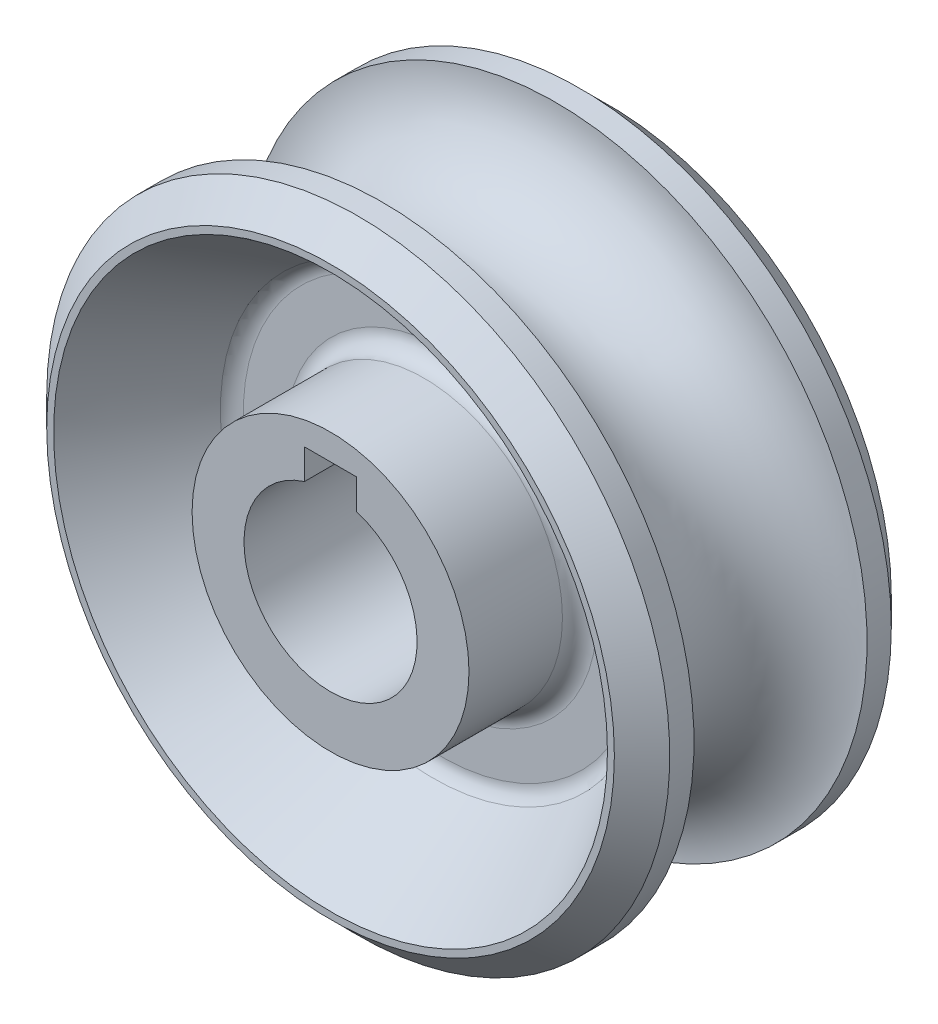
ISO-10303-21;
HEADER;
FILE_DESCRIPTION(('STEP AP214'),'2;1');
FILE_NAME('part.step','',(''),(''),'','','');
FILE_SCHEMA(('AUTOMOTIVE_DESIGN { 1 0 10303 214 1 1 1 1 }'));
ENDSEC;
DATA;
#1=APPLICATION_CONTEXT('core data for automotive mechanical design processes');
#2=APPLICATION_PROTOCOL_DEFINITION('international standard','automotive_design',2000,#1);
#3=PRODUCT_CONTEXT('',#1,'mechanical');
#4=PRODUCT('Part','Part','',(#3));
#5=PRODUCT_RELATED_PRODUCT_CATEGORY('part','',(#4));
#6=PRODUCT_DEFINITION_FORMATION('','',#4);
#7=PRODUCT_DEFINITION_CONTEXT('part definition',#1,'design');
#8=PRODUCT_DEFINITION('design','',#6,#7);
#9=PRODUCT_DEFINITION_SHAPE('','',#8);
#10=(LENGTH_UNIT() NAMED_UNIT(*) SI_UNIT(.MILLI.,.METRE.));
#11=(NAMED_UNIT(*) PLANE_ANGLE_UNIT() SI_UNIT($,.RADIAN.));
#12=(NAMED_UNIT(*) SI_UNIT($,.STERADIAN.) SOLID_ANGLE_UNIT());
#13=UNCERTAINTY_MEASURE_WITH_UNIT(LENGTH_MEASURE(1.E-05),#10,'distance_accuracy_value','');
#14=(GEOMETRIC_REPRESENTATION_CONTEXT(3) GLOBAL_UNCERTAINTY_ASSIGNED_CONTEXT((#13)) GLOBAL_UNIT_ASSIGNED_CONTEXT((#10,
#11,#12)) REPRESENTATION_CONTEXT('',''));
#15=CARTESIAN_POINT('',(0.,0.,0.));
#16=DIRECTION('',(0.,0.,1.));
#17=DIRECTION('',(1.,0.,0.));
#18=AXIS2_PLACEMENT_3D('',#15,#16,#17);
#19=CARTESIAN_POINT('',(0.,0.,12.7));
#20=DIRECTION('',(0.,0.,1.));
#21=DIRECTION('',(1.,0.,0.));
#22=AXIS2_PLACEMENT_3D('',#19,#20,#21);
#23=PLANE('',#22);
#24=DIRECTION('',(0.,-1.,0.));
#25=VECTOR('',#24,1.);
#26=CARTESIAN_POINT('',(-2.3876,10.3251,12.7));
#27=LINE('',#26,#25);
#28=CARTESIAN_POINT('',(-2.3876,10.3251,12.7));
#29=VERTEX_POINT('',#28);
#30=CARTESIAN_POINT('',(-2.3876,7.56989250187874,12.7));
#31=VERTEX_POINT('',#30);
#32=EDGE_CURVE('E82',#29,#31,#27,.T.);
#33=ORIENTED_EDGE('',*,*,#32,.F.);
#34=DIRECTION('',(-1.,0.,0.));
#35=VECTOR('',#34,1.);
#36=CARTESIAN_POINT('',(-2.3876,10.3251,12.7));
#37=LINE('',#36,#35);
#38=CARTESIAN_POINT('',(2.3876,10.3251,12.7));
#39=VERTEX_POINT('',#38);
#40=EDGE_CURVE('E81',#39,#29,#37,.T.);
#41=ORIENTED_EDGE('',*,*,#40,.F.);
#42=DIRECTION('',(0.,1.,0.));
#43=VECTOR('',#42,1.);
#44=CARTESIAN_POINT('',(2.3876,10.3251,12.7));
#45=LINE('',#44,#43);
#46=CARTESIAN_POINT('',(2.3876,7.56989250187874,12.7));
#47=VERTEX_POINT('',#46);
#48=EDGE_CURVE('E72',#47,#39,#45,.T.);
#49=ORIENTED_EDGE('',*,*,#48,.F.);
#50=CARTESIAN_POINT('',(0.,0.,12.7));
#51=DIRECTION('',(0.,0.,1.));
#52=DIRECTION('',(1.,0.,0.));
#53=AXIS2_PLACEMENT_3D('',#50,#51,#52);
#54=CIRCLE('',#53,7.9375);
#55=EDGE_CURVE('E114',#31,#47,#54,.T.);
#56=ORIENTED_EDGE('',*,*,#55,.F.);
#57=EDGE_LOOP('',(#33,#41,#49,#56));
#58=FACE_BOUND('',#57,.T.);
#59=CARTESIAN_POINT('',(0.,0.,12.7));
#60=DIRECTION('',(0.,0.,1.));
#61=DIRECTION('',(1.,0.,0.));
#62=AXIS2_PLACEMENT_3D('',#59,#60,#61);
#63=CIRCLE('',#62,12.7);
#64=CARTESIAN_POINT('',(12.7,0.,12.7));
#65=VERTEX_POINT('',#64);
#66=EDGE_CURVE('E100',#65,#65,#63,.T.);
#67=ORIENTED_EDGE('',*,*,#66,.T.);
#68=EDGE_LOOP('',(#67));
#69=FACE_BOUND('',#68,.T.);
#70=ADVANCED_FACE('F34',(#58,#69),#23,.T.);
#71=CARTESIAN_POINT('',(0.,0.,-12.7));
#72=DIRECTION('',(0.,0.,1.));
#73=DIRECTION('',(1.,0.,0.));
#74=AXIS2_PLACEMENT_3D('',#71,#72,#73);
#75=PLANE('',#74);
#76=CARTESIAN_POINT('',(0.,0.,-12.7));
#77=DIRECTION('',(0.,0.,1.));
#78=DIRECTION('',(1.,0.,0.));
#79=AXIS2_PLACEMENT_3D('',#76,#77,#78);
#80=CIRCLE('',#79,26.035);
#81=CARTESIAN_POINT('',(26.035,0.,-12.7));
#82=VERTEX_POINT('',#81);
#83=EDGE_CURVE('E133',#82,#82,#80,.F.);
#84=ORIENTED_EDGE('',*,*,#83,.T.);
#85=EDGE_LOOP('',(#84));
#86=FACE_BOUND('',#85,.T.);
#87=CARTESIAN_POINT('',(0.,0.,-12.7));
#88=DIRECTION('',(0.,0.,1.));
#89=DIRECTION('',(1.,0.,0.));
#90=AXIS2_PLACEMENT_3D('',#87,#88,#89);
#91=CIRCLE('',#90,25.4);
#92=CARTESIAN_POINT('',(25.4,0.,-12.7));
#93=VERTEX_POINT('',#92);
#94=EDGE_CURVE('E110',#93,#93,#91,.T.);
#95=ORIENTED_EDGE('',*,*,#94,.T.);
#96=EDGE_LOOP('',(#95));
#97=FACE_BOUND('',#96,.T.);
#98=ADVANCED_FACE('F185',(#86,#97),#75,.F.);
#99=DIRECTION('',(-1.,0.,0.));
#100=VECTOR('',#99,1.);
#101=CARTESIAN_POINT('',(-2.3876,10.3251,-12.7));
#102=LINE('',#101,#100);
#103=CARTESIAN_POINT('',(2.3876,10.3251,-12.7));
#104=VERTEX_POINT('',#103);
#105=CARTESIAN_POINT('',(-2.3876,10.3251,-12.7));
#106=VERTEX_POINT('',#105);
#107=EDGE_CURVE('E89',#104,#106,#102,.T.);
#108=ORIENTED_EDGE('',*,*,#107,.T.);
#109=DIRECTION('',(0.,-1.,0.));
#110=VECTOR('',#109,1.);
#111=CARTESIAN_POINT('',(-2.3876,10.3251,-12.7));
#112=LINE('',#111,#110);
#113=CARTESIAN_POINT('',(-2.3876,7.56989250187874,-12.7));
#114=VERTEX_POINT('',#113);
#115=EDGE_CURVE('E93',#106,#114,#112,.T.);
#116=ORIENTED_EDGE('',*,*,#115,.T.);
#117=CARTESIAN_POINT('',(0.,0.,-12.7));
#118=DIRECTION('',(0.,0.,1.));
#119=DIRECTION('',(1.,0.,0.));
#120=AXIS2_PLACEMENT_3D('',#117,#118,#119);
#121=CIRCLE('',#120,7.9375);
#122=CARTESIAN_POINT('',(2.3876,7.56989250187874,-12.7));
#123=VERTEX_POINT('',#122);
#124=EDGE_CURVE('E117',#114,#123,#121,.T.);
#125=ORIENTED_EDGE('',*,*,#124,.T.);
#126=DIRECTION('',(0.,1.,0.));
#127=VECTOR('',#126,1.);
#128=CARTESIAN_POINT('',(2.3876,10.3251,-12.7));
#129=LINE('',#128,#127);
#130=EDGE_CURVE('E49',#123,#104,#129,.T.);
#131=ORIENTED_EDGE('',*,*,#130,.T.);
#132=EDGE_LOOP('',(#108,#116,#125,#131));
#133=FACE_BOUND('',#132,.T.);
#134=CARTESIAN_POINT('',(0.,0.,-12.7));
#135=DIRECTION('',(0.,0.,1.));
#136=DIRECTION('',(1.,0.,0.));
#137=AXIS2_PLACEMENT_3D('',#134,#135,#136);
#138=CIRCLE('',#137,12.7);
#139=CARTESIAN_POINT('',(12.7,0.,-12.7));
#140=VERTEX_POINT('',#139);
#141=EDGE_CURVE('E107',#140,#140,#138,.T.);
#142=ORIENTED_EDGE('',*,*,#141,.F.);
#143=EDGE_LOOP('',(#142));
#144=FACE_BOUND('',#143,.T.);
#145=ADVANCED_FACE('F191',(#133,#144),#75,.F.);
#146=CARTESIAN_POINT('',(0.,0.,12.7));
#147=DIRECTION('',(0.,0.,-1.));
#148=DIRECTION('',(-1.,0.,0.));
#149=AXIS2_PLACEMENT_3D('',#146,#147,#148);
#150=CYLINDRICAL_SURFACE('',#149,28.575);
#151=CARTESIAN_POINT('',(0.,0.,10.16));
#152=DIRECTION('',(0.,0.,1.));
#153=DIRECTION('',(1.,0.,0.));
#154=AXIS2_PLACEMENT_3D('',#151,#152,#153);
#155=CIRCLE('',#154,28.575);
#156=CARTESIAN_POINT('',(-28.575,0.,10.16));
#157=VERTEX_POINT('',#156);
#158=EDGE_CURVE('E127',#157,#157,#155,.F.);
#159=CARTESIAN_POINT('',(0.,0.,7.9375));
#160=DIRECTION('',(0.,0.,-1.));
#161=DIRECTION('',(-1.,0.,0.));
#162=AXIS2_PLACEMENT_3D('',#159,#160,#161);
#163=CIRCLE('',#162,28.575);
#164=CARTESIAN_POINT('',(-28.575,0.,7.9375));
#165=VERTEX_POINT('',#164);
#166=EDGE_CURVE('E120',#165,#165,#163,.T.);
#167=CARTESIAN_POINT('',(-28.575,0.,10.16));
#168=CARTESIAN_POINT('',(-28.575,0.,10.1368489583334));
#169=CARTESIAN_POINT('',(-28.575,0.,10.1136979166667));
#170=CARTESIAN_POINT('',(-28.575,0.,10.0673958333334));
#171=CARTESIAN_POINT('',(-28.575,0.,10.0442447916667));
#172=CARTESIAN_POINT('',(-28.575,0.,9.99794270833336));
#173=CARTESIAN_POINT('',(-28.575,0.,9.97479166666669));
#174=CARTESIAN_POINT('',(-28.575,0.,9.92848958333336));
#175=CARTESIAN_POINT('',(-28.575,0.,9.90533854166669));
#176=CARTESIAN_POINT('',(-28.575,0.,9.85903645833336));
#177=CARTESIAN_POINT('',(-28.575,0.,9.83588541666669));
#178=CARTESIAN_POINT('',(-28.575,0.,9.78958333333336));
#179=CARTESIAN_POINT('',(-28.575,0.,9.76643229166669));
#180=CARTESIAN_POINT('',(-28.575,0.,9.72013020833336));
#181=CARTESIAN_POINT('',(-28.575,0.,9.69697916666669));
#182=CARTESIAN_POINT('',(-28.575,0.,9.65067708333335));
#183=CARTESIAN_POINT('',(-28.575,0.,9.62752604166669));
#184=CARTESIAN_POINT('',(-28.575,0.,9.58122395833335));
#185=CARTESIAN_POINT('',(-28.575,0.,9.55807291666669));
#186=CARTESIAN_POINT('',(-28.575,0.,9.51177083333335));
#187=CARTESIAN_POINT('',(-28.575,0.,9.48861979166669));
#188=CARTESIAN_POINT('',(-28.575,0.,9.44231770833335));
#189=CARTESIAN_POINT('',(-28.575,0.,9.41916666666669));
#190=CARTESIAN_POINT('',(-28.575,0.,9.37286458333335));
#191=CARTESIAN_POINT('',(-28.575,0.,9.34971354166668));
#192=CARTESIAN_POINT('',(-28.575,0.,9.30341145833335));
#193=CARTESIAN_POINT('',(-28.575,0.,9.28026041666668));
#194=CARTESIAN_POINT('',(-28.575,0.,9.23395833333335));
#195=CARTESIAN_POINT('',(-28.575,0.,9.21080729166668));
#196=CARTESIAN_POINT('',(-28.575,0.,9.16450520833335));
#197=CARTESIAN_POINT('',(-28.575,0.,9.14135416666668));
#198=CARTESIAN_POINT('',(-28.575,0.,9.09505208333335));
#199=CARTESIAN_POINT('',(-28.575,0.,9.07190104166668));
#200=CARTESIAN_POINT('',(-28.575,0.,9.02559895833334));
#201=CARTESIAN_POINT('',(-28.575,0.,9.00244791666668));
#202=CARTESIAN_POINT('',(-28.575,0.,8.95614583333334));
#203=CARTESIAN_POINT('',(-28.575,0.,8.93299479166668));
#204=CARTESIAN_POINT('',(-28.575,0.,8.88669270833334));
#205=CARTESIAN_POINT('',(-28.575,0.,8.86354166666668));
#206=CARTESIAN_POINT('',(-28.575,0.,8.81723958333334));
#207=CARTESIAN_POINT('',(-28.575,0.,8.79408854166668));
#208=CARTESIAN_POINT('',(-28.575,0.,8.74778645833334));
#209=CARTESIAN_POINT('',(-28.575,0.,8.72463541666668));
#210=CARTESIAN_POINT('',(-28.575,0.,8.67833333333334));
#211=CARTESIAN_POINT('',(-28.575,0.,8.65518229166667));
#212=CARTESIAN_POINT('',(-28.575,0.,8.60888020833334));
#213=CARTESIAN_POINT('',(-28.575,0.,8.58572916666667));
#214=CARTESIAN_POINT('',(-28.575,0.,8.53942708333334));
#215=CARTESIAN_POINT('',(-28.575,0.,8.51627604166667));
#216=CARTESIAN_POINT('',(-28.575,0.,8.46997395833334));
#217=CARTESIAN_POINT('',(-28.575,0.,8.44682291666667));
#218=CARTESIAN_POINT('',(-28.575,0.,8.40052083333334));
#219=CARTESIAN_POINT('',(-28.575,0.,8.37736979166667));
#220=CARTESIAN_POINT('',(-28.575,0.,8.33106770833334));
#221=CARTESIAN_POINT('',(-28.575,0.,8.30791666666667));
#222=CARTESIAN_POINT('',(-28.575,0.,8.26161458333334));
#223=CARTESIAN_POINT('',(-28.575,0.,8.23846354166667));
#224=CARTESIAN_POINT('',(-28.575,0.,8.19216145833333));
#225=CARTESIAN_POINT('',(-28.575,0.,8.16901041666667));
#226=CARTESIAN_POINT('',(-28.575,0.,8.12270833333333));
#227=CARTESIAN_POINT('',(-28.575,0.,8.09955729166667));
#228=CARTESIAN_POINT('',(-28.575,0.,8.05325520833333));
#229=CARTESIAN_POINT('',(-28.575,0.,8.03010416666666));
#230=CARTESIAN_POINT('',(-28.575,0.,7.98380208333333));
#231=CARTESIAN_POINT('',(-28.575,0.,7.96065104166666));
#232=CARTESIAN_POINT('',(-28.575,0.,7.9375));
#233=B_SPLINE_CURVE_WITH_KNOTS('',3,(#167,#168,#169,#170,#171,#172,#173,#174,#175,#176,#177,
#178,#179,#180,#181,#182,#183,#184,#185,#186,#187,#188,#189,#190,#191,#192,#193,#194,#195,#196,
#197,#198,#199,#200,#201,#202,#203,#204,#205,#206,#207,#208,#209,#210,#211,#212,#213,#214,#215,
#216,#217,#218,#219,#220,#221,#222,#223,#224,#225,#226,#227,#228,#229,#230,#231,#232),
.UNSPECIFIED.,.F.,.F.,(4,2,2,2,2,2,2,2,2,2,2,2,2,2,2,2,2,2,2,2,2,2,2,2,2,2,2,2,2,2,2,2,4),(0.,
0.0694531250000022,0.138906250000003,0.208359375000003,0.277812500000004,0.347265625000004,
0.416718750000006,0.486171875000007,0.555625000000007,0.62507812500001,0.69453125000001,
0.763984375000011,0.833437500000011,0.902890625000013,0.972343750000014,1.04179687500001,
1.11125000000002,1.18070312500002,1.25015625000002,1.31960937500002,1.38906250000002,
1.45851562500002,1.52796875000002,1.59742187500002,1.66687500000002,1.73632812500002,
1.80578125000003,1.87523437500003,1.94468750000003,2.01414062500003,2.08359375000003,
2.15304687500003,2.22250000000003),.UNSPECIFIED.);
#234=EDGE_CURVE('BSEAM205',#157,#165,#233,.T.);
#235=ORIENTED_EDGE('',*,*,#158,.T.);
#236=ORIENTED_EDGE('',*,*,#166,.F.);
#237=ORIENTED_EDGE('',*,*,#234,.T.);
#238=ORIENTED_EDGE('',*,*,#234,.F.);
#239=EDGE_LOOP('',(#235,#237,#236,#238));
#240=FACE_BOUND('',#239,.T.);
#241=ADVANCED_FACE('F205',(#240),#150,.T.);
#242=CARTESIAN_POINT('',(0.,0.,-10.16));
#243=DIRECTION('',(0.,0.,1.));
#244=DIRECTION('',(1.,0.,0.));
#245=AXIS2_PLACEMENT_3D('',#242,#243,#244);
#246=CIRCLE('',#245,28.575);
#247=CARTESIAN_POINT('',(-28.575,0.,-10.16));
#248=VERTEX_POINT('',#247);
#249=EDGE_CURVE('E130',#248,#248,#246,.T.);
#250=CARTESIAN_POINT('',(0.,0.,-7.9375));
#251=DIRECTION('',(0.,0.,1.));
#252=DIRECTION('',(1.,0.,0.));
#253=AXIS2_PLACEMENT_3D('',#250,#251,#252);
#254=CIRCLE('',#253,28.575);
#255=CARTESIAN_POINT('',(-28.575,0.,-7.93750000000001));
#256=VERTEX_POINT('',#255);
#257=EDGE_CURVE('E113',#256,#256,#254,.T.);
#258=CARTESIAN_POINT('',(-28.575,0.,-10.16));
#259=CARTESIAN_POINT('',(-28.575,0.,-10.1368489583333));
#260=CARTESIAN_POINT('',(-28.575,0.,-10.1136979166666));
#261=CARTESIAN_POINT('',(-28.575,0.,-10.0673958333333));
#262=CARTESIAN_POINT('',(-28.575,0.,-10.0442447916666));
#263=CARTESIAN_POINT('',(-28.575,0.,-9.9979427083333));
#264=CARTESIAN_POINT('',(-28.575,0.,-9.97479166666664));
#265=CARTESIAN_POINT('',(-28.575,0.,-9.9284895833333));
#266=CARTESIAN_POINT('',(-28.575,0.,-9.90533854166664));
#267=CARTESIAN_POINT('',(-28.575,0.,-9.8590364583333));
#268=CARTESIAN_POINT('',(-28.575,0.,-9.83588541666664));
#269=CARTESIAN_POINT('',(-28.575,0.,-9.7895833333333));
#270=CARTESIAN_POINT('',(-28.575,0.,-9.76643229166664));
#271=CARTESIAN_POINT('',(-28.575,0.,-9.72013020833331));
#272=CARTESIAN_POINT('',(-28.575,0.,-9.69697916666664));
#273=CARTESIAN_POINT('',(-28.575,0.,-9.65067708333331));
#274=CARTESIAN_POINT('',(-28.575,0.,-9.62752604166664));
#275=CARTESIAN_POINT('',(-28.575,0.,-9.58122395833331));
#276=CARTESIAN_POINT('',(-28.575,0.,-9.55807291666664));
#277=CARTESIAN_POINT('',(-28.575,0.,-9.51177083333331));
#278=CARTESIAN_POINT('',(-28.575,0.,-9.48861979166664));
#279=CARTESIAN_POINT('',(-28.575,0.,-9.44231770833331));
#280=CARTESIAN_POINT('',(-28.575,0.,-9.41916666666665));
#281=CARTESIAN_POINT('',(-28.575,0.,-9.37286458333331));
#282=CARTESIAN_POINT('',(-28.575,0.,-9.34971354166665));
#283=CARTESIAN_POINT('',(-28.575,0.,-9.30341145833331));
#284=CARTESIAN_POINT('',(-28.575,0.,-9.28026041666665));
#285=CARTESIAN_POINT('',(-28.575,0.,-9.23395833333331));
#286=CARTESIAN_POINT('',(-28.575,0.,-9.21080729166665));
#287=CARTESIAN_POINT('',(-28.575,0.,-9.16450520833332));
#288=CARTESIAN_POINT('',(-28.575,0.,-9.14135416666665));
#289=CARTESIAN_POINT('',(-28.575,0.,-9.09505208333332));
#290=CARTESIAN_POINT('',(-28.575,0.,-9.07190104166665));
#291=CARTESIAN_POINT('',(-28.575,0.,-9.02559895833332));
#292=CARTESIAN_POINT('',(-28.575,0.,-9.00244791666665));
#293=CARTESIAN_POINT('',(-28.575,0.,-8.95614583333332));
#294=CARTESIAN_POINT('',(-28.575,0.,-8.93299479166665));
#295=CARTESIAN_POINT('',(-28.575,0.,-8.88669270833332));
#296=CARTESIAN_POINT('',(-28.575,0.,-8.86354166666666));
#297=CARTESIAN_POINT('',(-28.575,0.,-8.81723958333332));
#298=CARTESIAN_POINT('',(-28.575,0.,-8.79408854166666));
#299=CARTESIAN_POINT('',(-28.575,0.,-8.74778645833332));
#300=CARTESIAN_POINT('',(-28.575,0.,-8.72463541666666));
#301=CARTESIAN_POINT('',(-28.575,0.,-8.67833333333332));
#302=CARTESIAN_POINT('',(-28.575,0.,-8.65518229166666));
#303=CARTESIAN_POINT('',(-28.575,0.,-8.60888020833333));
#304=CARTESIAN_POINT('',(-28.575,0.,-8.58572916666666));
#305=CARTESIAN_POINT('',(-28.575,0.,-8.53942708333333));
#306=CARTESIAN_POINT('',(-28.575,0.,-8.51627604166666));
#307=CARTESIAN_POINT('',(-28.575,0.,-8.46997395833333));
#308=CARTESIAN_POINT('',(-28.575,0.,-8.44682291666666));
#309=CARTESIAN_POINT('',(-28.575,0.,-8.40052083333333));
#310=CARTESIAN_POINT('',(-28.575,0.,-8.37736979166666));
#311=CARTESIAN_POINT('',(-28.575,0.,-8.33106770833333));
#312=CARTESIAN_POINT('',(-28.575,0.,-8.30791666666667));
#313=CARTESIAN_POINT('',(-28.575,0.,-8.26161458333333));
#314=CARTESIAN_POINT('',(-28.575,0.,-8.23846354166667));
#315=CARTESIAN_POINT('',(-28.575,0.,-8.19216145833333));
#316=CARTESIAN_POINT('',(-28.575,0.,-8.16901041666667));
#317=CARTESIAN_POINT('',(-28.575,0.,-8.12270833333333));
#318=CARTESIAN_POINT('',(-28.575,0.,-8.09955729166667));
#319=CARTESIAN_POINT('',(-28.575,0.,-8.05325520833334));
#320=CARTESIAN_POINT('',(-28.575,0.,-8.03010416666667));
#321=CARTESIAN_POINT('',(-28.575,0.,-7.98380208333334));
#322=CARTESIAN_POINT('',(-28.575,0.,-7.96065104166667));
#323=CARTESIAN_POINT('',(-28.575,0.,-7.93750000000001));
#324=B_SPLINE_CURVE_WITH_KNOTS('',3,(#258,#259,#260,#261,#262,#263,#264,#265,#266,#267,#268,
#269,#270,#271,#272,#273,#274,#275,#276,#277,#278,#279,#280,#281,#282,#283,#284,#285,#286,#287,
#288,#289,#290,#291,#292,#293,#294,#295,#296,#297,#298,#299,#300,#301,#302,#303,#304,#305,#306,
#307,#308,#309,#310,#311,#312,#313,#314,#315,#316,#317,#318,#319,#320,#321,#322,#323),
.UNSPECIFIED.,.F.,.F.,(4,2,2,2,2,2,2,2,2,2,2,2,2,2,2,2,2,2,2,2,2,2,2,2,2,2,2,2,2,2,2,2,4),(0.,
0.0694531250000005,0.138906249999998,0.208359374999995,0.277812499999995,0.347265624999996,
0.416718749999993,0.48617187499999,0.55562499999999,0.625078124999991,0.694531249999988,
0.763984374999985,0.833437499999985,0.902890624999986,0.972343749999983,1.04179687499998,
1.11124999999998,1.18070312499998,1.25015624999998,1.31960937499997,1.38906249999998,
1.45851562499998,1.52796874999997,1.59742187499997,1.66687499999997,1.73632812499997,
1.80578124999997,1.87523437499997,1.94468749999997,2.01414062499997,2.08359374999996,
2.15304687499996,2.22249999999996),.UNSPECIFIED.);
#325=EDGE_CURVE('BSEAM197',#248,#256,#324,.T.);
#326=ORIENTED_EDGE('',*,*,#249,.T.);
#327=ORIENTED_EDGE('',*,*,#257,.F.);
#328=ORIENTED_EDGE('',*,*,#325,.T.);
#329=ORIENTED_EDGE('',*,*,#325,.F.);
#330=EDGE_LOOP('',(#326,#328,#327,#329));
#331=FACE_BOUND('',#330,.T.);
#332=ADVANCED_FACE('F197',(#331),#150,.T.);
#333=CARTESIAN_POINT('',(0.,0.,12.7));
#334=DIRECTION('',(0.,0.,1.));
#335=DIRECTION('',(1.,0.,0.));
#336=AXIS2_PLACEMENT_3D('',#333,#334,#335);
#337=CIRCLE('',#336,26.035);
#338=CARTESIAN_POINT('',(26.035,0.,12.7));
#339=VERTEX_POINT('',#338);
#340=EDGE_CURVE('E116',#339,#339,#337,.T.);
#341=ORIENTED_EDGE('',*,*,#340,.T.);
#342=EDGE_LOOP('',(#341));
#343=FACE_BOUND('',#342,.T.);
#344=CARTESIAN_POINT('',(0.,0.,12.7));
#345=DIRECTION('',(0.,0.,1.));
#346=DIRECTION('',(1.,0.,0.));
#347=AXIS2_PLACEMENT_3D('',#344,#345,#346);
#348=CIRCLE('',#347,25.4);
#349=CARTESIAN_POINT('',(25.4,0.,12.7));
#350=VERTEX_POINT('',#349);
#351=EDGE_CURVE('E104',#350,#350,#348,.T.);
#352=ORIENTED_EDGE('',*,*,#351,.F.);
#353=EDGE_LOOP('',(#352));
#354=FACE_BOUND('',#353,.T.);
#355=ADVANCED_FACE('F187',(#343,#354),#23,.T.);
#356=CARTESIAN_POINT('',(0.,0.,12.7));
#357=DIRECTION('',(0.,0.,-1.));
#358=DIRECTION('',(-1.,0.,0.));
#359=AXIS2_PLACEMENT_3D('',#356,#357,#358);
#360=CYLINDRICAL_SURFACE('',#359,7.9375);
#361=DIRECTION('',(0.,0.,-1.));
#362=VECTOR('',#361,1.);
#363=CARTESIAN_POINT('',(-2.3876,7.56989250187874,12.7));
#364=LINE('',#363,#362);
#365=EDGE_CURVE('E11',#31,#114,#364,.T.);
#366=ORIENTED_EDGE('',*,*,#365,.F.);
#367=ORIENTED_EDGE('',*,*,#55,.T.);
#368=DIRECTION('',(0.,0.,-1.));
#369=VECTOR('',#368,1.);
#370=CARTESIAN_POINT('',(2.3876,7.56989250187874,12.7));
#371=LINE('',#370,#369);
#372=EDGE_CURVE('E42',#123,#47,#371,.F.);
#373=ORIENTED_EDGE('',*,*,#372,.F.);
#374=ORIENTED_EDGE('',*,*,#124,.F.);
#375=EDGE_LOOP('',(#366,#367,#373,#374));
#376=FACE_BOUND('',#375,.T.);
#377=ADVANCED_FACE('F196',(#376),#360,.F.);
#378=CARTESIAN_POINT('',(0.,0.,0.));
#379=DIRECTION('',(0.,0.,1.));
#380=DIRECTION('',(1.,0.,0.));
#381=AXIS2_PLACEMENT_3D('',#378,#379,#380);
#382=TOROIDAL_SURFACE('',#381,28.575,7.9375);
#383=ORIENTED_EDGE('',*,*,#257,.T.);
#384=EDGE_LOOP('',(#383));
#385=FACE_BOUND('',#384,.T.);
#386=ORIENTED_EDGE('',*,*,#166,.T.);
#387=EDGE_LOOP('',(#386));
#388=FACE_BOUND('',#387,.T.);
#389=ADVANCED_FACE('F203',(#385,#388),#382,.F.);
#390=CARTESIAN_POINT('',(0.,0.,-12.7));
#391=DIRECTION('',(0.,0.,-1.));
#392=DIRECTION('',(-1.,0.,0.));
#393=AXIS2_PLACEMENT_3D('',#390,#391,#392);
#394=CONICAL_SURFACE('',#393,25.4,0.558599315343563);
#395=CARTESIAN_POINT('',(0.,0.,-3.28612668274496));
#396=DIRECTION('',(0.,0.,-1.));
#397=DIRECTION('',(-1.,0.,0.));
#398=AXIS2_PLACEMENT_3D('',#395,#396,#397);
#399=CIRCLE('',#398,19.5163291767156);
#400=CARTESIAN_POINT('',(-19.5163291767156,0.,-3.28612668274496));
#401=VERTEX_POINT('',#400);
#402=EDGE_CURVE('E136',#401,#401,#399,.F.);
#403=ORIENTED_EDGE('',*,*,#402,.T.);
#404=EDGE_LOOP('',(#403));
#405=FACE_BOUND('',#404,.T.);
#406=ORIENTED_EDGE('',*,*,#94,.F.);
#407=EDGE_LOOP('',(#406));
#408=FACE_BOUND('',#407,.T.);
#409=ADVANCED_FACE('F324',(#405,#408),#394,.F.);
#410=CARTESIAN_POINT('',(0.,0.,0.));
#411=DIRECTION('',(0.,0.,1.));
#412=DIRECTION('',(1.,0.,0.));
#413=AXIS2_PLACEMENT_3D('',#410,#411,#412);
#414=CYLINDRICAL_SURFACE('',#413,12.7);
#415=CARTESIAN_POINT('',(0.,0.,-4.1275));
#416=DIRECTION('',(0.,0.,-1.));
#417=DIRECTION('',(-1.,0.,0.));
#418=AXIS2_PLACEMENT_3D('',#415,#416,#417);
#419=CIRCLE('',#418,12.7);
#420=CARTESIAN_POINT('',(-12.7,0.,-4.1275));
#421=VERTEX_POINT('',#420);
#422=EDGE_CURVE('E145',#421,#421,#419,.T.);
#423=ORIENTED_EDGE('',*,*,#422,.T.);
#424=EDGE_LOOP('',(#423));
#425=FACE_BOUND('',#424,.T.);
#426=ORIENTED_EDGE('',*,*,#141,.T.);
#427=EDGE_LOOP('',(#426));
#428=FACE_BOUND('',#427,.T.);
#429=ADVANCED_FACE('F315',(#425,#428),#414,.T.);
#430=CARTESIAN_POINT('',(0.,12.7,-2.54));
#431=DIRECTION('',(0.,0.,-1.));
#432=DIRECTION('',(-1.,0.,0.));
#433=AXIS2_PLACEMENT_3D('',#430,#431,#432);
#434=PLANE('',#433);
#435=CARTESIAN_POINT('',(0.,0.,-2.54));
#436=DIRECTION('',(0.,0.,-1.));
#437=DIRECTION('',(-1.,0.,0.));
#438=AXIS2_PLACEMENT_3D('',#435,#436,#437);
#439=CIRCLE('',#438,18.1701318691075);
#440=CARTESIAN_POINT('',(-18.1701318691075,0.,-2.54));
#441=VERTEX_POINT('',#440);
#442=EDGE_CURVE('E142',#441,#441,#439,.T.);
#443=ORIENTED_EDGE('',*,*,#442,.T.);
#444=EDGE_LOOP('',(#443));
#445=FACE_BOUND('',#444,.T.);
#446=CARTESIAN_POINT('',(0.,0.,-2.54));
#447=DIRECTION('',(0.,0.,-1.));
#448=DIRECTION('',(-1.,0.,0.));
#449=AXIS2_PLACEMENT_3D('',#446,#447,#448);
#450=CIRCLE('',#449,14.2875);
#451=CARTESIAN_POINT('',(-14.2875,0.,-2.54));
#452=VERTEX_POINT('',#451);
#453=EDGE_CURVE('E139',#452,#452,#450,.F.);
#454=ORIENTED_EDGE('',*,*,#453,.T.);
#455=EDGE_LOOP('',(#454));
#456=FACE_BOUND('',#455,.T.);
#457=ADVANCED_FACE('F181',(#445,#456),#434,.T.);
#458=CARTESIAN_POINT('',(0.,0.,0.));
#459=DIRECTION('',(0.,0.,1.));
#460=DIRECTION('',(1.,0.,0.));
#461=AXIS2_PLACEMENT_3D('',#458,#459,#460);
#462=CYLINDRICAL_SURFACE('',#461,12.7);
#463=CARTESIAN_POINT('',(0.,0.,4.1275));
#464=DIRECTION('',(0.,0.,1.));
#465=DIRECTION('',(1.,0.,0.));
#466=AXIS2_PLACEMENT_3D('',#463,#464,#465);
#467=CIRCLE('',#466,12.7);
#468=CARTESIAN_POINT('',(12.7,0.,4.1275));
#469=VERTEX_POINT('',#468);
#470=EDGE_CURVE('E148',#469,#469,#467,.T.);
#471=ORIENTED_EDGE('',*,*,#470,.T.);
#472=EDGE_LOOP('',(#471));
#473=FACE_BOUND('',#472,.T.);
#474=ORIENTED_EDGE('',*,*,#66,.F.);
#475=EDGE_LOOP('',(#474));
#476=FACE_BOUND('',#475,.T.);
#477=ADVANCED_FACE('F172',(#473,#476),#462,.T.);
#478=CARTESIAN_POINT('',(0.,12.7,2.54));
#479=DIRECTION('',(0.,0.,1.));
#480=DIRECTION('',(1.,0.,0.));
#481=AXIS2_PLACEMENT_3D('',#478,#479,#480);
#482=PLANE('',#481);
#483=CARTESIAN_POINT('',(0.,0.,2.54));
#484=DIRECTION('',(0.,0.,1.));
#485=DIRECTION('',(1.,0.,0.));
#486=AXIS2_PLACEMENT_3D('',#483,#484,#485);
#487=CIRCLE('',#486,14.2875);
#488=CARTESIAN_POINT('',(14.2875,0.,2.54));
#489=VERTEX_POINT('',#488);
#490=EDGE_CURVE('E154',#489,#489,#487,.F.);
#491=ORIENTED_EDGE('',*,*,#490,.T.);
#492=EDGE_LOOP('',(#491));
#493=FACE_BOUND('',#492,.T.);
#494=CARTESIAN_POINT('',(0.,0.,2.54));
#495=DIRECTION('',(0.,0.,1.));
#496=DIRECTION('',(1.,0.,0.));
#497=AXIS2_PLACEMENT_3D('',#494,#495,#496);
#498=CIRCLE('',#497,18.1701318691075);
#499=CARTESIAN_POINT('',(18.1701318691075,0.,2.54));
#500=VERTEX_POINT('',#499);
#501=EDGE_CURVE('E151',#500,#500,#498,.T.);
#502=ORIENTED_EDGE('',*,*,#501,.T.);
#503=EDGE_LOOP('',(#502));
#504=FACE_BOUND('',#503,.T.);
#505=ADVANCED_FACE('F170',(#493,#504),#482,.T.);
#506=CARTESIAN_POINT('',(0.,0.,2.54));
#507=DIRECTION('',(0.,0.,1.));
#508=DIRECTION('',(1.,0.,0.));
#509=AXIS2_PLACEMENT_3D('',#506,#507,#508);
#510=CONICAL_SURFACE('',#509,19.05,0.558599315343563);
#511=CARTESIAN_POINT('',(0.,0.,3.28612668274495));
#512=DIRECTION('',(0.,0.,1.));
#513=DIRECTION('',(1.,0.,0.));
#514=AXIS2_PLACEMENT_3D('',#511,#512,#513);
#515=CIRCLE('',#514,19.5163291767156);
#516=CARTESIAN_POINT('',(19.5163291767156,0.,3.28612668274495));
#517=VERTEX_POINT('',#516);
#518=EDGE_CURVE('E157',#517,#517,#515,.F.);
#519=ORIENTED_EDGE('',*,*,#518,.T.);
#520=EDGE_LOOP('',(#519));
#521=FACE_BOUND('',#520,.T.);
#522=ORIENTED_EDGE('',*,*,#351,.T.);
#523=EDGE_LOOP('',(#522));
#524=FACE_BOUND('',#523,.T.);
#525=ADVANCED_FACE('F161',(#521,#524),#510,.F.);
#526=CARTESIAN_POINT('',(0.,0.,12.7));
#527=DIRECTION('',(0.,0.,-1.));
#528=DIRECTION('',(-1.,0.,0.));
#529=AXIS2_PLACEMENT_3D('',#526,#527,#528);
#530=CONICAL_SURFACE('',#529,26.035,0.785398163397446);
#531=ORIENTED_EDGE('',*,*,#158,.F.);
#532=EDGE_LOOP('',(#531));
#533=FACE_BOUND('',#532,.T.);
#534=ORIENTED_EDGE('',*,*,#340,.F.);
#535=EDGE_LOOP('',(#534));
#536=FACE_BOUND('',#535,.T.);
#537=ADVANCED_FACE('F179',(#533,#536),#530,.T.);
#538=CARTESIAN_POINT('',(0.,0.,-10.16));
#539=DIRECTION('',(0.,0.,1.));
#540=DIRECTION('',(1.,0.,0.));
#541=AXIS2_PLACEMENT_3D('',#538,#539,#540);
#542=CONICAL_SURFACE('',#541,28.575,0.78539816339745);
#543=ORIENTED_EDGE('',*,*,#83,.F.);
#544=EDGE_LOOP('',(#543));
#545=FACE_BOUND('',#544,.T.);
#546=ORIENTED_EDGE('',*,*,#249,.F.);
#547=EDGE_LOOP('',(#546));
#548=FACE_BOUND('',#547,.T.);
#549=ADVANCED_FACE('F213',(#545,#548),#542,.T.);
#550=CARTESIAN_POINT('',(0.,0.,-4.1275));
#551=DIRECTION('',(0.,0.,-1.));
#552=DIRECTION('',(-1.,0.,0.));
#553=AXIS2_PLACEMENT_3D('',#550,#551,#552);
#554=TOROIDAL_SURFACE('',#553,18.1701318691075,1.5875);
#555=ORIENTED_EDGE('',*,*,#442,.F.);
#556=EDGE_LOOP('',(#555));
#557=FACE_BOUND('',#556,.T.);
#558=ORIENTED_EDGE('',*,*,#402,.F.);
#559=EDGE_LOOP('',(#558));
#560=FACE_BOUND('',#559,.T.);
#561=ADVANCED_FACE('F219',(#557,#560),#554,.F.);
#562=CARTESIAN_POINT('',(0.,0.,-4.1275));
#563=DIRECTION('',(0.,0.,-1.));
#564=DIRECTION('',(-1.,0.,0.));
#565=AXIS2_PLACEMENT_3D('',#562,#563,#564);
#566=TOROIDAL_SURFACE('',#565,14.2875,1.5875);
#567=ORIENTED_EDGE('',*,*,#422,.F.);
#568=EDGE_LOOP('',(#567));
#569=FACE_BOUND('',#568,.T.);
#570=ORIENTED_EDGE('',*,*,#453,.F.);
#571=EDGE_LOOP('',(#570));
#572=FACE_BOUND('',#571,.T.);
#573=ADVANCED_FACE('F226',(#569,#572),#566,.F.);
#574=CARTESIAN_POINT('',(0.,0.,4.1275));
#575=DIRECTION('',(0.,0.,1.));
#576=DIRECTION('',(1.,0.,0.));
#577=AXIS2_PLACEMENT_3D('',#574,#575,#576);
#578=TOROIDAL_SURFACE('',#577,14.2875,1.5875);
#579=ORIENTED_EDGE('',*,*,#490,.F.);
#580=EDGE_LOOP('',(#579));
#581=FACE_BOUND('',#580,.T.);
#582=ORIENTED_EDGE('',*,*,#470,.F.);
#583=EDGE_LOOP('',(#582));
#584=FACE_BOUND('',#583,.T.);
#585=ADVANCED_FACE('F167',(#581,#584),#578,.F.);
#586=CARTESIAN_POINT('',(0.,0.,4.1275));
#587=DIRECTION('',(0.,0.,1.));
#588=DIRECTION('',(1.,0.,0.));
#589=AXIS2_PLACEMENT_3D('',#586,#587,#588);
#590=TOROIDAL_SURFACE('',#589,18.1701318691075,1.5875);
#591=ORIENTED_EDGE('',*,*,#518,.F.);
#592=EDGE_LOOP('',(#591));
#593=FACE_BOUND('',#592,.T.);
#594=ORIENTED_EDGE('',*,*,#501,.F.);
#595=EDGE_LOOP('',(#594));
#596=FACE_BOUND('',#595,.T.);
#597=ADVANCED_FACE('F36',(#593,#596),#590,.F.);
#598=CARTESIAN_POINT('',(-2.3876,10.3251,-12.7));
#599=DIRECTION('',(-1.,0.,0.));
#600=DIRECTION('',(0.,-1.,0.));
#601=AXIS2_PLACEMENT_3D('',#598,#599,#600);
#602=PLANE('',#601);
#603=ORIENTED_EDGE('',*,*,#365,.T.);
#604=ORIENTED_EDGE('',*,*,#115,.F.);
#605=DIRECTION('',(0.,0.,1.));
#606=VECTOR('',#605,1.);
#607=CARTESIAN_POINT('',(-2.3876,10.3251,-12.7));
#608=LINE('',#607,#606);
#609=EDGE_CURVE('E90',#106,#29,#608,.T.);
#610=ORIENTED_EDGE('',*,*,#609,.T.);
#611=ORIENTED_EDGE('',*,*,#32,.T.);
#612=EDGE_LOOP('',(#603,#604,#610,#611));
#613=FACE_BOUND('',#612,.T.);
#614=ADVANCED_FACE('F166',(#613),#602,.F.);
#615=CARTESIAN_POINT('',(-2.3876,10.3251,-12.7));
#616=DIRECTION('',(0.,1.,0.));
#617=DIRECTION('',(0.,0.,1.));
#618=AXIS2_PLACEMENT_3D('',#615,#616,#617);
#619=PLANE('',#618);
#620=ORIENTED_EDGE('',*,*,#609,.F.);
#621=ORIENTED_EDGE('',*,*,#107,.F.);
#622=DIRECTION('',(0.,0.,1.));
#623=VECTOR('',#622,1.);
#624=CARTESIAN_POINT('',(2.3876,10.3251,-12.7));
#625=LINE('',#624,#623);
#626=EDGE_CURVE('E75',#104,#39,#625,.T.);
#627=ORIENTED_EDGE('',*,*,#626,.T.);
#628=ORIENTED_EDGE('',*,*,#40,.T.);
#629=EDGE_LOOP('',(#620,#621,#627,#628));
#630=FACE_BOUND('',#629,.T.);
#631=ADVANCED_FACE('F86',(#630),#619,.F.);
#632=CARTESIAN_POINT('',(2.3876,10.3251,-12.7));
#633=DIRECTION('',(1.,0.,0.));
#634=DIRECTION('',(0.,1.,0.));
#635=AXIS2_PLACEMENT_3D('',#632,#633,#634);
#636=PLANE('',#635);
#637=ORIENTED_EDGE('',*,*,#372,.T.);
#638=ORIENTED_EDGE('',*,*,#48,.T.);
#639=ORIENTED_EDGE('',*,*,#626,.F.);
#640=ORIENTED_EDGE('',*,*,#130,.F.);
#641=EDGE_LOOP('',(#637,#638,#639,#640));
#642=FACE_BOUND('',#641,.T.);
#643=ADVANCED_FACE('F74',(#642),#636,.F.);
#644=CLOSED_SHELL('',(#70,#98,#145,#241,#332,#355,#377,#389,#409,#429,#457,#477,#505,#525,#537,
#549,#561,#573,#585,#597,#614,#631,#643));
#645=MANIFOLD_SOLID_BREP('B2',#644);
#646=ADVANCED_BREP_SHAPE_REPRESENTATION('',(#18,#645),#14);
#647=SHAPE_DEFINITION_REPRESENTATION(#9,#646);
ENDSEC;
END-ISO-10303-21;
